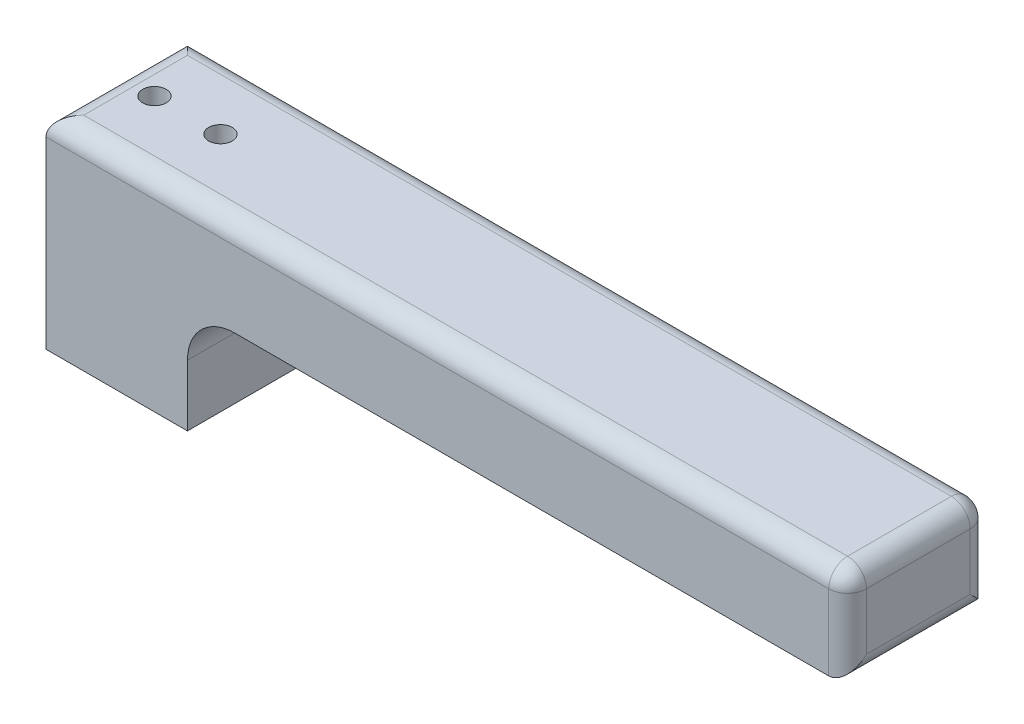
ISO-10303-21;
HEADER;
FILE_DESCRIPTION(('STEP AP214'),'2;1');
FILE_NAME('part.step','',(''),(''),'','','');
FILE_SCHEMA(('AUTOMOTIVE_DESIGN { 1 0 10303 214 1 1 1 1 }'));
ENDSEC;
DATA;
#1=APPLICATION_CONTEXT('core data for automotive mechanical design processes');
#2=APPLICATION_PROTOCOL_DEFINITION('international standard','automotive_design',2000,#1);
#3=PRODUCT_CONTEXT('',#1,'mechanical');
#4=PRODUCT('Part','Part','',(#3));
#5=PRODUCT_RELATED_PRODUCT_CATEGORY('part','',(#4));
#6=PRODUCT_DEFINITION_FORMATION('','',#4);
#7=PRODUCT_DEFINITION_CONTEXT('part definition',#1,'design');
#8=PRODUCT_DEFINITION('design','',#6,#7);
#9=PRODUCT_DEFINITION_SHAPE('','',#8);
#10=(LENGTH_UNIT() NAMED_UNIT(*) SI_UNIT(.MILLI.,.METRE.));
#11=(NAMED_UNIT(*) PLANE_ANGLE_UNIT() SI_UNIT($,.RADIAN.));
#12=(NAMED_UNIT(*) SI_UNIT($,.STERADIAN.) SOLID_ANGLE_UNIT());
#13=UNCERTAINTY_MEASURE_WITH_UNIT(LENGTH_MEASURE(1.E-05),#10,'distance_accuracy_value','');
#14=(GEOMETRIC_REPRESENTATION_CONTEXT(3) GLOBAL_UNCERTAINTY_ASSIGNED_CONTEXT((#13)) GLOBAL_UNIT_ASSIGNED_CONTEXT((#10,
#11,#12)) REPRESENTATION_CONTEXT('',''));
#15=CARTESIAN_POINT('',(0.,0.,0.));
#16=DIRECTION('',(0.,0.,1.));
#17=DIRECTION('',(1.,0.,0.));
#18=AXIS2_PLACEMENT_3D('',#15,#16,#17);
#19=CARTESIAN_POINT('',(15.,0.,15.));
#20=DIRECTION('',(0.,1.,0.));
#21=DIRECTION('',(-1.,0.,0.));
#22=AXIS2_PLACEMENT_3D('',#19,#20,#21);
#23=PLANE('',#22);
#24=CARTESIAN_POINT('',(4.,0.,7.5));
#25=DIRECTION('',(0.,-1.,0.));
#26=DIRECTION('',(1.,0.,0.));
#27=AXIS2_PLACEMENT_3D('',#24,#25,#26);
#28=CIRCLE('',#27,1.25);
#29=CARTESIAN_POINT('',(5.25,0.,7.5));
#30=VERTEX_POINT('',#29);
#31=EDGE_CURVE('E467',#30,#30,#28,.T.);
#32=ORIENTED_EDGE('',*,*,#31,.F.);
#33=EDGE_LOOP('',(#32));
#34=FACE_BOUND('',#33,.T.);
#35=CARTESIAN_POINT('',(11.,0.,7.5));
#36=DIRECTION('',(0.,-1.,0.));
#37=DIRECTION('',(1.,0.,0.));
#38=AXIS2_PLACEMENT_3D('',#35,#36,#37);
#39=CIRCLE('',#38,1.25);
#40=CARTESIAN_POINT('',(12.25,0.,7.5));
#41=VERTEX_POINT('',#40);
#42=EDGE_CURVE('E205',#41,#41,#39,.T.);
#43=ORIENTED_EDGE('',*,*,#42,.F.);
#44=EDGE_LOOP('',(#43));
#45=FACE_BOUND('',#44,.T.);
#46=DIRECTION('',(1.,0.,0.));
#47=VECTOR('',#46,1.);
#48=CARTESIAN_POINT('',(15.,0.,0.));
#49=LINE('',#48,#47);
#50=CARTESIAN_POINT('',(0.,0.,0.));
#51=VERTEX_POINT('',#50);
#52=CARTESIAN_POINT('',(15.,0.,0.));
#53=VERTEX_POINT('',#52);
#54=EDGE_CURVE('E149',#51,#53,#49,.T.);
#55=ORIENTED_EDGE('',*,*,#54,.T.);
#56=DIRECTION('',(0.,0.,-1.));
#57=VECTOR('',#56,1.);
#58=CARTESIAN_POINT('',(15.,0.,15.));
#59=LINE('',#58,#57);
#60=CARTESIAN_POINT('',(15.,0.,15.));
#61=VERTEX_POINT('',#60);
#62=EDGE_CURVE('E130',#61,#53,#59,.T.);
#63=ORIENTED_EDGE('',*,*,#62,.F.);
#64=DIRECTION('',(1.,0.,0.));
#65=VECTOR('',#64,1.);
#66=CARTESIAN_POINT('',(15.,0.,15.));
#67=LINE('',#66,#65);
#68=CARTESIAN_POINT('',(0.,0.,15.));
#69=VERTEX_POINT('',#68);
#70=EDGE_CURVE('E137',#69,#61,#67,.T.);
#71=ORIENTED_EDGE('',*,*,#70,.F.);
#72=DIRECTION('',(0.,0.,-1.));
#73=VECTOR('',#72,1.);
#74=CARTESIAN_POINT('',(0.,0.,15.));
#75=LINE('',#74,#73);
#76=EDGE_CURVE('E152',#69,#51,#75,.T.);
#77=ORIENTED_EDGE('',*,*,#76,.T.);
#78=EDGE_LOOP('',(#55,#63,#71,#77));
#79=FACE_BOUND('',#78,.T.);
#80=ADVANCED_FACE('F41',(#34,#45,#79),#23,.F.);
#81=CARTESIAN_POINT('',(15.,11.5,15.));
#82=DIRECTION('',(-1.,0.,0.));
#83=DIRECTION('',(0.,0.,1.));
#84=AXIS2_PLACEMENT_3D('',#81,#82,#83);
#85=PLANE('',#84);
#86=DIRECTION('',(0.,1.,0.));
#87=VECTOR('',#86,1.);
#88=CARTESIAN_POINT('',(15.,11.5,0.));
#89=LINE('',#88,#87);
#90=CARTESIAN_POINT('',(15.,6.5,0.));
#91=VERTEX_POINT('',#90);
#92=EDGE_CURVE('E478',#53,#91,#89,.T.);
#93=ORIENTED_EDGE('',*,*,#92,.T.);
#94=DIRECTION('',(0.,0.,-1.));
#95=VECTOR('',#94,1.);
#96=CARTESIAN_POINT('',(15.,6.5,15.));
#97=LINE('',#96,#95);
#98=CARTESIAN_POINT('',(15.,6.5,15.));
#99=VERTEX_POINT('',#98);
#100=EDGE_CURVE('E133',#91,#99,#97,.F.);
#101=ORIENTED_EDGE('',*,*,#100,.T.);
#102=DIRECTION('',(0.,1.,0.));
#103=VECTOR('',#102,1.);
#104=CARTESIAN_POINT('',(15.,11.5,15.));
#105=LINE('',#104,#103);
#106=EDGE_CURVE('E125',#61,#99,#105,.T.);
#107=ORIENTED_EDGE('',*,*,#106,.F.);
#108=ORIENTED_EDGE('',*,*,#62,.T.);
#109=EDGE_LOOP('',(#93,#101,#107,#108));
#110=FACE_BOUND('',#109,.T.);
#111=ADVANCED_FACE('F128',(#110),#85,.F.);
#112=CARTESIAN_POINT('',(85.,11.5,15.));
#113=DIRECTION('',(0.,1.,0.));
#114=DIRECTION('',(-1.,0.,0.));
#115=AXIS2_PLACEMENT_3D('',#112,#113,#114);
#116=PLANE('',#115);
#117=DIRECTION('',(1.,0.,0.));
#118=VECTOR('',#117,1.);
#119=CARTESIAN_POINT('',(85.,11.5,0.));
#120=LINE('',#119,#118);
#121=CARTESIAN_POINT('',(20.,11.5,0.));
#122=VERTEX_POINT('',#121);
#123=CARTESIAN_POINT('',(83.,11.5,0.));
#124=VERTEX_POINT('',#123);
#125=EDGE_CURVE('E482',#122,#124,#120,.T.);
#126=ORIENTED_EDGE('',*,*,#125,.T.);
#127=DIRECTION('',(0.,0.,-1.));
#128=VECTOR('',#127,1.);
#129=CARTESIAN_POINT('',(83.,11.5,15.));
#130=LINE('',#129,#128);
#131=CARTESIAN_POINT('',(83.,11.5,15.));
#132=VERTEX_POINT('',#131);
#133=EDGE_CURVE('E184',#124,#132,#130,.F.);
#134=ORIENTED_EDGE('',*,*,#133,.T.);
#135=DIRECTION('',(1.,0.,0.));
#136=VECTOR('',#135,1.);
#137=CARTESIAN_POINT('',(85.,11.5,15.));
#138=LINE('',#137,#136);
#139=CARTESIAN_POINT('',(20.,11.5,15.));
#140=VERTEX_POINT('',#139);
#141=EDGE_CURVE('E136',#140,#132,#138,.T.);
#142=ORIENTED_EDGE('',*,*,#141,.F.);
#143=DIRECTION('',(0.,0.,-1.));
#144=VECTOR('',#143,1.);
#145=CARTESIAN_POINT('',(20.,11.5,0.));
#146=LINE('',#145,#144);
#147=EDGE_CURVE('E151',#140,#122,#146,.T.);
#148=ORIENTED_EDGE('',*,*,#147,.T.);
#149=EDGE_LOOP('',(#126,#134,#142,#148));
#150=FACE_BOUND('',#149,.T.);
#151=ADVANCED_FACE('F299',(#150),#116,.F.);
#152=CARTESIAN_POINT('',(85.,21.5,15.));
#153=DIRECTION('',(-1.,0.,0.));
#154=DIRECTION('',(0.,-1.,0.));
#155=AXIS2_PLACEMENT_3D('',#152,#153,#154);
#156=PLANE('',#155);
#157=DIRECTION('',(0.,1.,0.));
#158=VECTOR('',#157,1.);
#159=CARTESIAN_POINT('',(85.,21.5,13.));
#160=LINE('',#159,#158);
#161=CARTESIAN_POINT('',(85.,19.5,13.));
#162=VERTEX_POINT('',#161);
#163=CARTESIAN_POINT('',(85.,13.5,13.));
#164=VERTEX_POINT('',#163);
#165=EDGE_CURVE('E169',#162,#164,#160,.F.);
#166=ORIENTED_EDGE('',*,*,#165,.T.);
#167=DIRECTION('',(0.,0.,-1.));
#168=VECTOR('',#167,1.);
#169=CARTESIAN_POINT('',(85.,13.5,15.));
#170=LINE('',#169,#168);
#171=CARTESIAN_POINT('',(85.,13.5,2.));
#172=VERTEX_POINT('',#171);
#173=EDGE_CURVE('E180',#164,#172,#170,.T.);
#174=ORIENTED_EDGE('',*,*,#173,.T.);
#175=DIRECTION('',(0.,1.,0.));
#176=VECTOR('',#175,1.);
#177=CARTESIAN_POINT('',(85.,21.5,2.));
#178=LINE('',#177,#176);
#179=CARTESIAN_POINT('',(85.,19.5,2.));
#180=VERTEX_POINT('',#179);
#181=EDGE_CURVE('E176',#172,#180,#178,.T.);
#182=ORIENTED_EDGE('',*,*,#181,.T.);
#183=DIRECTION('',(0.,0.,-1.));
#184=VECTOR('',#183,1.);
#185=CARTESIAN_POINT('',(85.,19.5,15.));
#186=LINE('',#185,#184);
#187=EDGE_CURVE('E172',#180,#162,#186,.F.);
#188=ORIENTED_EDGE('',*,*,#187,.T.);
#189=EDGE_LOOP('',(#166,#174,#182,#188));
#190=FACE_BOUND('',#189,.T.);
#191=ADVANCED_FACE('F260',(#190),#156,.F.);
#192=CARTESIAN_POINT('',(0.,21.5,15.));
#193=DIRECTION('',(0.,-1.,0.));
#194=DIRECTION('',(1.,0.,0.));
#195=AXIS2_PLACEMENT_3D('',#192,#193,#194);
#196=PLANE('',#195);
#197=CARTESIAN_POINT('',(4.,21.5,7.5));
#198=DIRECTION('',(0.,-1.,0.));
#199=DIRECTION('',(1.,0.,0.));
#200=AXIS2_PLACEMENT_3D('',#197,#198,#199);
#201=CIRCLE('',#200,1.25);
#202=CARTESIAN_POINT('',(5.25,21.5,7.5));
#203=VERTEX_POINT('',#202);
#204=EDGE_CURVE('E479',#203,#203,#201,.T.);
#205=ORIENTED_EDGE('',*,*,#204,.T.);
#206=EDGE_LOOP('',(#205));
#207=FACE_BOUND('',#206,.T.);
#208=CARTESIAN_POINT('',(11.,21.5,7.5));
#209=DIRECTION('',(0.,-1.,0.));
#210=DIRECTION('',(1.,0.,0.));
#211=AXIS2_PLACEMENT_3D('',#208,#209,#210);
#212=CIRCLE('',#211,1.25);
#213=CARTESIAN_POINT('',(12.25,21.5,7.5));
#214=VERTEX_POINT('',#213);
#215=EDGE_CURVE('E461',#214,#214,#212,.T.);
#216=ORIENTED_EDGE('',*,*,#215,.T.);
#217=EDGE_LOOP('',(#216));
#218=FACE_BOUND('',#217,.T.);
#219=DIRECTION('',(0.,0.,-1.));
#220=VECTOR('',#219,1.);
#221=CARTESIAN_POINT('',(83.,21.5,15.));
#222=LINE('',#221,#220);
#223=CARTESIAN_POINT('',(83.,21.5,13.));
#224=VERTEX_POINT('',#223);
#225=CARTESIAN_POINT('',(83.,21.5,2.));
#226=VERTEX_POINT('',#225);
#227=EDGE_CURVE('E191',#224,#226,#222,.T.);
#228=ORIENTED_EDGE('',*,*,#227,.T.);
#229=DIRECTION('',(-1.,0.,0.));
#230=VECTOR('',#229,1.);
#231=CARTESIAN_POINT('',(0.,21.5,2.));
#232=LINE('',#231,#230);
#233=CARTESIAN_POINT('',(2.,21.5,2.));
#234=VERTEX_POINT('',#233);
#235=EDGE_CURVE('E224',#226,#234,#232,.T.);
#236=ORIENTED_EDGE('',*,*,#235,.T.);
#237=DIRECTION('',(0.,0.,-1.));
#238=VECTOR('',#237,1.);
#239=CARTESIAN_POINT('',(2.,21.5,15.));
#240=LINE('',#239,#238);
#241=CARTESIAN_POINT('',(2.,21.5,13.));
#242=VERTEX_POINT('',#241);
#243=EDGE_CURVE('E221',#234,#242,#240,.F.);
#244=ORIENTED_EDGE('',*,*,#243,.T.);
#245=DIRECTION('',(-1.,0.,0.));
#246=VECTOR('',#245,1.);
#247=CARTESIAN_POINT('',(0.,21.5,13.));
#248=LINE('',#247,#246);
#249=EDGE_CURVE('E218',#242,#224,#248,.F.);
#250=ORIENTED_EDGE('',*,*,#249,.T.);
#251=EDGE_LOOP('',(#228,#236,#244,#250));
#252=FACE_BOUND('',#251,.T.);
#253=ADVANCED_FACE('F280',(#207,#218,#252),#196,.F.);
#254=CARTESIAN_POINT('',(0.,0.,15.));
#255=DIRECTION('',(1.,0.,0.));
#256=DIRECTION('',(0.,0.,-1.));
#257=AXIS2_PLACEMENT_3D('',#254,#255,#256);
#258=PLANE('',#257);
#259=DIRECTION('',(0.,-1.,0.));
#260=VECTOR('',#259,1.);
#261=CARTESIAN_POINT('',(0.,0.,15.));
#262=LINE('',#261,#260);
#263=CARTESIAN_POINT('',(0.,19.5,15.));
#264=VERTEX_POINT('',#263);
#265=EDGE_CURVE('E141',#264,#69,#262,.T.);
#266=ORIENTED_EDGE('',*,*,#265,.F.);
#267=DIRECTION('',(0.,0.,-1.));
#268=VECTOR('',#267,1.);
#269=CARTESIAN_POINT('',(0.,19.5,15.));
#270=LINE('',#269,#268);
#271=CARTESIAN_POINT('',(0.,19.5,0.));
#272=VERTEX_POINT('',#271);
#273=EDGE_CURVE('E51',#264,#272,#270,.T.);
#274=ORIENTED_EDGE('',*,*,#273,.T.);
#275=DIRECTION('',(0.,-1.,0.));
#276=VECTOR('',#275,1.);
#277=CARTESIAN_POINT('',(0.,0.,0.));
#278=LINE('',#277,#276);
#279=EDGE_CURVE('E146',#272,#51,#278,.T.);
#280=ORIENTED_EDGE('',*,*,#279,.T.);
#281=ORIENTED_EDGE('',*,*,#76,.F.);
#282=EDGE_LOOP('',(#266,#274,#280,#281));
#283=FACE_BOUND('',#282,.T.);
#284=ADVANCED_FACE('F385',(#283),#258,.F.);
#285=CARTESIAN_POINT('',(0.,0.,15.));
#286=DIRECTION('',(0.,0.,-1.));
#287=DIRECTION('',(-1.,0.,0.));
#288=AXIS2_PLACEMENT_3D('',#285,#286,#287);
#289=PLANE('',#288);
#290=DIRECTION('',(0.,1.,0.));
#291=VECTOR('',#290,1.);
#292=CARTESIAN_POINT('',(83.,-2.3037127760972E-13,15.));
#293=LINE('',#292,#291);
#294=CARTESIAN_POINT('',(83.,19.5,15.));
#295=VERTEX_POINT('',#294);
#296=EDGE_CURVE('E195',#132,#295,#293,.T.);
#297=ORIENTED_EDGE('',*,*,#296,.T.);
#298=DIRECTION('',(-1.,0.,0.));
#299=VECTOR('',#298,1.);
#300=CARTESIAN_POINT('',(0.,19.5,15.));
#301=LINE('',#300,#299);
#302=EDGE_CURVE('E11',#295,#264,#301,.T.);
#303=ORIENTED_EDGE('',*,*,#302,.T.);
#304=ORIENTED_EDGE('',*,*,#265,.T.);
#305=ORIENTED_EDGE('',*,*,#70,.T.);
#306=ORIENTED_EDGE('',*,*,#106,.T.);
#307=CARTESIAN_POINT('',(20.,6.5,15.));
#308=DIRECTION('',(0.,0.,-1.));
#309=DIRECTION('',(-1.,0.,0.));
#310=AXIS2_PLACEMENT_3D('',#307,#308,#309);
#311=CIRCLE('',#310,5.);
#312=EDGE_CURVE('E166',#99,#140,#311,.T.);
#313=ORIENTED_EDGE('',*,*,#312,.T.);
#314=ORIENTED_EDGE('',*,*,#141,.T.);
#315=EDGE_LOOP('',(#297,#303,#304,#305,#306,#313,#314));
#316=FACE_BOUND('',#315,.T.);
#317=ADVANCED_FACE('F140',(#316),#289,.F.);
#318=CARTESIAN_POINT('',(0.,0.,0.));
#319=DIRECTION('',(0.,0.,-1.));
#320=DIRECTION('',(-1.,0.,0.));
#321=AXIS2_PLACEMENT_3D('',#318,#319,#320);
#322=PLANE('',#321);
#323=ORIENTED_EDGE('',*,*,#279,.F.);
#324=DIRECTION('',(-1.,0.,0.));
#325=VECTOR('',#324,1.);
#326=CARTESIAN_POINT('',(83.,19.5,0.));
#327=LINE('',#326,#325);
#328=CARTESIAN_POINT('',(83.,19.5,0.));
#329=VERTEX_POINT('',#328);
#330=EDGE_CURVE('E227',#272,#329,#327,.F.);
#331=ORIENTED_EDGE('',*,*,#330,.T.);
#332=DIRECTION('',(0.,1.,0.));
#333=VECTOR('',#332,1.);
#334=CARTESIAN_POINT('',(83.,11.5,0.));
#335=LINE('',#334,#333);
#336=EDGE_CURVE('E188',#329,#124,#335,.F.);
#337=ORIENTED_EDGE('',*,*,#336,.T.);
#338=ORIENTED_EDGE('',*,*,#125,.F.);
#339=CARTESIAN_POINT('',(20.,6.5,0.));
#340=DIRECTION('',(0.,0.,-1.));
#341=DIRECTION('',(-1.,0.,0.));
#342=AXIS2_PLACEMENT_3D('',#339,#340,#341);
#343=CIRCLE('',#342,5.);
#344=EDGE_CURVE('E163',#122,#91,#343,.F.);
#345=ORIENTED_EDGE('',*,*,#344,.T.);
#346=ORIENTED_EDGE('',*,*,#92,.F.);
#347=ORIENTED_EDGE('',*,*,#54,.F.);
#348=EDGE_LOOP('',(#323,#331,#337,#338,#345,#346,#347));
#349=FACE_BOUND('',#348,.T.);
#350=ADVANCED_FACE('F368',(#349),#322,.T.);
#351=CARTESIAN_POINT('',(11.,21.5,7.5));
#352=DIRECTION('',(0.,-1.,0.));
#353=DIRECTION('',(1.,0.,0.));
#354=AXIS2_PLACEMENT_3D('',#351,#352,#353);
#355=CYLINDRICAL_SURFACE('',#354,1.25);
#356=ORIENTED_EDGE('',*,*,#215,.F.);
#357=EDGE_LOOP('',(#356));
#358=FACE_BOUND('',#357,.T.);
#359=ORIENTED_EDGE('',*,*,#42,.T.);
#360=EDGE_LOOP('',(#359));
#361=FACE_BOUND('',#360,.T.);
#362=ADVANCED_FACE('F373',(#358,#361),#355,.F.);
#363=CARTESIAN_POINT('',(4.,21.5,7.5));
#364=DIRECTION('',(0.,-1.,0.));
#365=DIRECTION('',(1.,0.,0.));
#366=AXIS2_PLACEMENT_3D('',#363,#364,#365);
#367=CYLINDRICAL_SURFACE('',#366,1.25);
#368=ORIENTED_EDGE('',*,*,#204,.F.);
#369=EDGE_LOOP('',(#368));
#370=FACE_BOUND('',#369,.T.);
#371=ORIENTED_EDGE('',*,*,#31,.T.);
#372=EDGE_LOOP('',(#371));
#373=FACE_BOUND('',#372,.T.);
#374=ADVANCED_FACE('F308',(#370,#373),#367,.F.);
#375=CARTESIAN_POINT('',(20.,6.5,15.));
#376=DIRECTION('',(0.,0.,1.));
#377=DIRECTION('',(1.,0.,0.));
#378=AXIS2_PLACEMENT_3D('',#375,#376,#377);
#379=CYLINDRICAL_SURFACE('',#378,5.);
#380=ORIENTED_EDGE('',*,*,#312,.F.);
#381=ORIENTED_EDGE('',*,*,#100,.F.);
#382=ORIENTED_EDGE('',*,*,#344,.F.);
#383=ORIENTED_EDGE('',*,*,#147,.F.);
#384=EDGE_LOOP('',(#380,#381,#382,#383));
#385=FACE_BOUND('',#384,.T.);
#386=ADVANCED_FACE('F305',(#385),#379,.F.);
#387=CARTESIAN_POINT('',(83.,19.5,15.));
#388=DIRECTION('',(0.,0.,-1.));
#389=DIRECTION('',(-1.,0.,0.));
#390=AXIS2_PLACEMENT_3D('',#387,#388,#389);
#391=CYLINDRICAL_SURFACE('',#390,2.);
#392=ORIENTED_EDGE('',*,*,#187,.F.);
#393=CARTESIAN_POINT('',(83.,19.5,2.));
#394=DIRECTION('',(0.,0.,-1.));
#395=DIRECTION('',(-1.,0.,0.));
#396=AXIS2_PLACEMENT_3D('',#393,#394,#395);
#397=CIRCLE('',#396,2.);
#398=EDGE_CURVE('E212',#180,#226,#397,.F.);
#399=ORIENTED_EDGE('',*,*,#398,.T.);
#400=ORIENTED_EDGE('',*,*,#227,.F.);
#401=CARTESIAN_POINT('',(83.,19.5,13.));
#402=DIRECTION('',(0.,0.,-1.));
#403=DIRECTION('',(-1.,0.,0.));
#404=AXIS2_PLACEMENT_3D('',#401,#402,#403);
#405=CIRCLE('',#404,2.);
#406=EDGE_CURVE('E209',#224,#162,#405,.T.);
#407=ORIENTED_EDGE('',*,*,#406,.T.);
#408=EDGE_LOOP('',(#392,#399,#400,#407));
#409=FACE_BOUND('',#408,.T.);
#410=ADVANCED_FACE('F257',(#409),#391,.T.);
#411=CARTESIAN_POINT('',(83.,-2.3037127760972E-13,13.));
#412=DIRECTION('',(0.,1.,0.));
#413=DIRECTION('',(-1.,0.,0.));
#414=AXIS2_PLACEMENT_3D('',#411,#412,#413);
#415=CYLINDRICAL_SURFACE('',#414,2.);
#416=ORIENTED_EDGE('',*,*,#165,.F.);
#417=CARTESIAN_POINT('',(83.,19.5,13.));
#418=DIRECTION('',(0.,1.,0.));
#419=DIRECTION('',(-1.,0.,0.));
#420=AXIS2_PLACEMENT_3D('',#417,#418,#419);
#421=CIRCLE('',#420,2.);
#422=EDGE_CURVE('E215',#162,#295,#421,.F.);
#423=ORIENTED_EDGE('',*,*,#422,.T.);
#424=ORIENTED_EDGE('',*,*,#296,.F.);
#425=CARTESIAN_POINT('',(83.,13.5,13.));
#426=DIRECTION('',(0.,0.707106781186547,0.707106781186547));
#427=DIRECTION('',(0.,0.707106781186547,-0.707106781186547));
#428=AXIS2_PLACEMENT_3D('',#425,#426,#427);
#429=ELLIPSE('',#428,2.82842712474619,2.);
#430=EDGE_CURVE('E202',#164,#132,#429,.F.);
#431=ORIENTED_EDGE('',*,*,#430,.F.);
#432=EDGE_LOOP('',(#416,#423,#424,#431));
#433=FACE_BOUND('',#432,.T.);
#434=ADVANCED_FACE('F264',(#433),#415,.T.);
#435=CARTESIAN_POINT('',(83.,21.5,2.));
#436=DIRECTION('',(0.,-1.,0.));
#437=DIRECTION('',(1.,0.,0.));
#438=AXIS2_PLACEMENT_3D('',#435,#436,#437);
#439=CYLINDRICAL_SURFACE('',#438,2.);
#440=ORIENTED_EDGE('',*,*,#336,.F.);
#441=CARTESIAN_POINT('',(83.,19.5,2.));
#442=DIRECTION('',(0.,-1.,0.));
#443=DIRECTION('',(1.,0.,0.));
#444=AXIS2_PLACEMENT_3D('',#441,#442,#443);
#445=CIRCLE('',#444,2.);
#446=EDGE_CURVE('E198',#329,#180,#445,.T.);
#447=ORIENTED_EDGE('',*,*,#446,.T.);
#448=ORIENTED_EDGE('',*,*,#181,.F.);
#449=CARTESIAN_POINT('',(83.,13.5,2.));
#450=DIRECTION('',(0.,-0.707106781186547,0.707106781186547));
#451=DIRECTION('',(0.,-0.707106781186547,-0.707106781186547));
#452=AXIS2_PLACEMENT_3D('',#449,#450,#451);
#453=ELLIPSE('',#452,2.82842712474619,2.);
#454=EDGE_CURVE('E199',#124,#172,#453,.T.);
#455=ORIENTED_EDGE('',*,*,#454,.F.);
#456=EDGE_LOOP('',(#440,#447,#448,#455));
#457=FACE_BOUND('',#456,.T.);
#458=ADVANCED_FACE('F273',(#457),#439,.T.);
#459=CARTESIAN_POINT('',(83.,13.5,15.));
#460=DIRECTION('',(0.,0.,-1.));
#461=DIRECTION('',(-1.,0.,0.));
#462=AXIS2_PLACEMENT_3D('',#459,#460,#461);
#463=CYLINDRICAL_SURFACE('',#462,2.);
#464=ORIENTED_EDGE('',*,*,#430,.T.);
#465=ORIENTED_EDGE('',*,*,#133,.F.);
#466=ORIENTED_EDGE('',*,*,#454,.T.);
#467=ORIENTED_EDGE('',*,*,#173,.F.);
#468=EDGE_LOOP('',(#464,#465,#466,#467));
#469=FACE_BOUND('',#468,.T.);
#470=ADVANCED_FACE('F269',(#469),#463,.T.);
#471=CARTESIAN_POINT('',(83.,19.5,13.));
#472=DIRECTION('',(0.,0.,1.));
#473=DIRECTION('',(1.,0.,0.));
#474=AXIS2_PLACEMENT_3D('',#471,#472,#473);
#475=SPHERICAL_SURFACE('',#474,2.);
#476=ORIENTED_EDGE('',*,*,#422,.F.);
#477=ORIENTED_EDGE('',*,*,#406,.F.);
#478=CARTESIAN_POINT('',(83.,19.5,13.));
#479=DIRECTION('',(-1.,0.,0.));
#480=DIRECTION('',(0.,0.,1.));
#481=AXIS2_PLACEMENT_3D('',#478,#479,#480);
#482=CIRCLE('',#481,2.);
#483=EDGE_CURVE('E45',#295,#224,#482,.T.);
#484=ORIENTED_EDGE('',*,*,#483,.F.);
#485=EDGE_LOOP('',(#476,#477,#484));
#486=FACE_BOUND('',#485,.T.);
#487=ADVANCED_FACE('F43',(#486),#475,.T.);
#488=CARTESIAN_POINT('',(0.,19.5,13.));
#489=DIRECTION('',(-1.,0.,0.));
#490=DIRECTION('',(0.,-1.,0.));
#491=AXIS2_PLACEMENT_3D('',#488,#489,#490);
#492=CYLINDRICAL_SURFACE('',#491,2.);
#493=ORIENTED_EDGE('',*,*,#483,.T.);
#494=ORIENTED_EDGE('',*,*,#249,.F.);
#495=CARTESIAN_POINT('',(2.,19.5,13.));
#496=DIRECTION('',(-0.707106781186547,0.,-0.707106781186547));
#497=DIRECTION('',(-0.707106781186547,0.,0.707106781186547));
#498=AXIS2_PLACEMENT_3D('',#495,#496,#497);
#499=ELLIPSE('',#498,2.82842712474619,2.);
#500=EDGE_CURVE('E239',#264,#242,#499,.T.);
#501=ORIENTED_EDGE('',*,*,#500,.F.);
#502=ORIENTED_EDGE('',*,*,#302,.F.);
#503=EDGE_LOOP('',(#493,#494,#501,#502));
#504=FACE_BOUND('',#503,.T.);
#505=ADVANCED_FACE('F250',(#504),#492,.T.);
#506=CARTESIAN_POINT('',(2.,19.5,15.));
#507=DIRECTION('',(0.,0.,-1.));
#508=DIRECTION('',(-1.,0.,0.));
#509=AXIS2_PLACEMENT_3D('',#506,#507,#508);
#510=CYLINDRICAL_SURFACE('',#509,2.);
#511=ORIENTED_EDGE('',*,*,#500,.T.);
#512=ORIENTED_EDGE('',*,*,#243,.F.);
#513=CARTESIAN_POINT('',(2.,19.5,2.));
#514=DIRECTION('',(0.707106781186547,0.,-0.707106781186547));
#515=DIRECTION('',(-0.707106781186547,0.,-0.707106781186547));
#516=AXIS2_PLACEMENT_3D('',#513,#514,#515);
#517=ELLIPSE('',#516,2.82842712474619,2.);
#518=EDGE_CURVE('E236',#272,#234,#517,.T.);
#519=ORIENTED_EDGE('',*,*,#518,.F.);
#520=ORIENTED_EDGE('',*,*,#273,.F.);
#521=EDGE_LOOP('',(#511,#512,#519,#520));
#522=FACE_BOUND('',#521,.T.);
#523=ADVANCED_FACE('F285',(#522),#510,.T.);
#524=CARTESIAN_POINT('',(0.,19.5,2.));
#525=DIRECTION('',(1.,0.,0.));
#526=DIRECTION('',(0.,1.,0.));
#527=AXIS2_PLACEMENT_3D('',#524,#525,#526);
#528=CYLINDRICAL_SURFACE('',#527,2.);
#529=ORIENTED_EDGE('',*,*,#518,.T.);
#530=ORIENTED_EDGE('',*,*,#235,.F.);
#531=CARTESIAN_POINT('',(83.,19.5,2.));
#532=DIRECTION('',(1.,0.,0.));
#533=DIRECTION('',(0.,0.,-1.));
#534=AXIS2_PLACEMENT_3D('',#531,#532,#533);
#535=CIRCLE('',#534,2.);
#536=EDGE_CURVE('E232',#329,#226,#535,.T.);
#537=ORIENTED_EDGE('',*,*,#536,.F.);
#538=ORIENTED_EDGE('',*,*,#330,.F.);
#539=EDGE_LOOP('',(#529,#530,#537,#538));
#540=FACE_BOUND('',#539,.T.);
#541=ADVANCED_FACE('F282',(#540),#528,.T.);
#542=CARTESIAN_POINT('',(83.,19.5,2.));
#543=DIRECTION('',(0.,0.,1.));
#544=DIRECTION('',(1.,0.,0.));
#545=AXIS2_PLACEMENT_3D('',#542,#543,#544);
#546=SPHERICAL_SURFACE('',#545,2.);
#547=ORIENTED_EDGE('',*,*,#536,.T.);
#548=ORIENTED_EDGE('',*,*,#398,.F.);
#549=ORIENTED_EDGE('',*,*,#446,.F.);
#550=EDGE_LOOP('',(#547,#548,#549));
#551=FACE_BOUND('',#550,.T.);
#552=ADVANCED_FACE('F277',(#551),#546,.T.);
#553=CLOSED_SHELL('',(#80,#111,#151,#191,#253,#284,#317,#350,#362,#374,#386,#410,#434,#458,#470,
#487,#505,#523,#541,#552));
#554=MANIFOLD_SOLID_BREP('B2',#553);
#555=ADVANCED_BREP_SHAPE_REPRESENTATION('',(#18,#554),#14);
#556=SHAPE_DEFINITION_REPRESENTATION(#9,#555);
ENDSEC;
END-ISO-10303-21;
